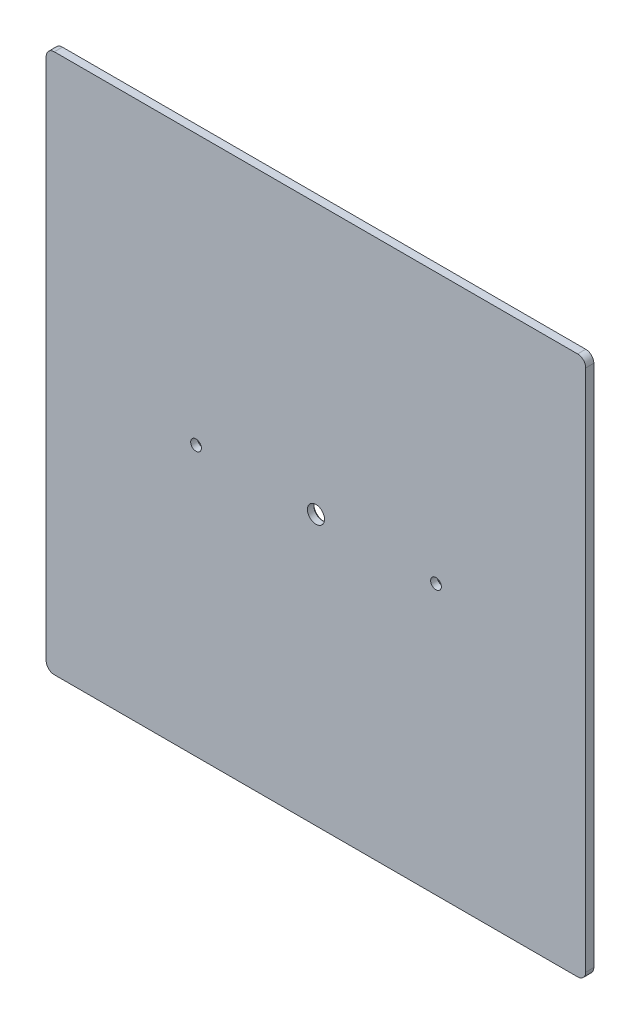
ISO-10303-21;
HEADER;
FILE_DESCRIPTION(('STEP AP214'),'2;1');
FILE_NAME('part.step','',(''),(''),'','','');
FILE_SCHEMA(('AUTOMOTIVE_DESIGN { 1 0 10303 214 1 1 1 1 }'));
ENDSEC;
DATA;
#1=APPLICATION_CONTEXT('core data for automotive mechanical design processes');
#2=APPLICATION_PROTOCOL_DEFINITION('international standard','automotive_design',2000,#1);
#3=PRODUCT_CONTEXT('',#1,'mechanical');
#4=PRODUCT('Part','Part','',(#3));
#5=PRODUCT_RELATED_PRODUCT_CATEGORY('part','',(#4));
#6=PRODUCT_DEFINITION_FORMATION('','',#4);
#7=PRODUCT_DEFINITION_CONTEXT('part definition',#1,'design');
#8=PRODUCT_DEFINITION('design','',#6,#7);
#9=PRODUCT_DEFINITION_SHAPE('','',#8);
#10=(LENGTH_UNIT() NAMED_UNIT(*) SI_UNIT(.MILLI.,.METRE.));
#11=(NAMED_UNIT(*) PLANE_ANGLE_UNIT() SI_UNIT($,.RADIAN.));
#12=(NAMED_UNIT(*) SI_UNIT($,.STERADIAN.) SOLID_ANGLE_UNIT());
#13=UNCERTAINTY_MEASURE_WITH_UNIT(LENGTH_MEASURE(1.E-05),#10,'distance_accuracy_value','');
#14=(GEOMETRIC_REPRESENTATION_CONTEXT(3) GLOBAL_UNCERTAINTY_ASSIGNED_CONTEXT((#13)) GLOBAL_UNIT_ASSIGNED_CONTEXT((#10,
#11,#12)) REPRESENTATION_CONTEXT('',''));
#15=CARTESIAN_POINT('',(0.,0.,0.));
#16=DIRECTION('',(0.,0.,1.));
#17=DIRECTION('',(1.,0.,0.));
#18=AXIS2_PLACEMENT_3D('',#15,#16,#17);
#19=CARTESIAN_POINT('',(100.,100.,3.));
#20=DIRECTION('',(-1.,0.,0.));
#21=DIRECTION('',(0.,-1.,0.));
#22=AXIS2_PLACEMENT_3D('',#19,#20,#21);
#23=PLANE('',#22);
#24=DIRECTION('',(0.,1.,0.));
#25=VECTOR('',#24,1.);
#26=CARTESIAN_POINT('',(100.,100.,3.));
#27=LINE('',#26,#25);
#28=CARTESIAN_POINT('',(100.,-97.,3.));
#29=VERTEX_POINT('',#28);
#30=CARTESIAN_POINT('',(100.,97.,3.));
#31=VERTEX_POINT('',#30);
#32=EDGE_CURVE('E143',#29,#31,#27,.T.);
#33=ORIENTED_EDGE('',*,*,#32,.F.);
#34=DIRECTION('',(0.,0.,-1.));
#35=VECTOR('',#34,1.);
#36=CARTESIAN_POINT('',(100.,-97.,3.));
#37=LINE('',#36,#35);
#38=CARTESIAN_POINT('',(100.,-97.,0.));
#39=VERTEX_POINT('',#38);
#40=EDGE_CURVE('E182',#29,#39,#37,.T.);
#41=ORIENTED_EDGE('',*,*,#40,.T.);
#42=DIRECTION('',(0.,1.,0.));
#43=VECTOR('',#42,1.);
#44=CARTESIAN_POINT('',(100.,100.,0.));
#45=LINE('',#44,#43);
#46=CARTESIAN_POINT('',(100.,97.,0.));
#47=VERTEX_POINT('',#46);
#48=EDGE_CURVE('E197',#39,#47,#45,.T.);
#49=ORIENTED_EDGE('',*,*,#48,.T.);
#50=DIRECTION('',(0.,0.,-1.));
#51=VECTOR('',#50,1.);
#52=CARTESIAN_POINT('',(100.,97.,3.));
#53=LINE('',#52,#51);
#54=EDGE_CURVE('E179',#47,#31,#53,.F.);
#55=ORIENTED_EDGE('',*,*,#54,.T.);
#56=EDGE_LOOP('',(#33,#41,#49,#55));
#57=FACE_BOUND('',#56,.T.);
#58=ADVANCED_FACE('F47',(#57),#23,.F.);
#59=CARTESIAN_POINT('',(-100.,100.,3.));
#60=DIRECTION('',(0.,-1.,0.));
#61=DIRECTION('',(0.,0.,-1.));
#62=AXIS2_PLACEMENT_3D('',#59,#60,#61);
#63=PLANE('',#62);
#64=DIRECTION('',(-1.,0.,0.));
#65=VECTOR('',#64,1.);
#66=CARTESIAN_POINT('',(-100.,100.,3.));
#67=LINE('',#66,#65);
#68=CARTESIAN_POINT('',(97.,100.,3.));
#69=VERTEX_POINT('',#68);
#70=CARTESIAN_POINT('',(-97.,100.,3.));
#71=VERTEX_POINT('',#70);
#72=EDGE_CURVE('E148',#69,#71,#67,.T.);
#73=ORIENTED_EDGE('',*,*,#72,.F.);
#74=DIRECTION('',(0.,0.,-1.));
#75=VECTOR('',#74,1.);
#76=CARTESIAN_POINT('',(97.,100.,3.));
#77=LINE('',#76,#75);
#78=CARTESIAN_POINT('',(97.,100.,0.));
#79=VERTEX_POINT('',#78);
#80=EDGE_CURVE('E11',#69,#79,#77,.T.);
#81=ORIENTED_EDGE('',*,*,#80,.T.);
#82=DIRECTION('',(-1.,0.,0.));
#83=VECTOR('',#82,1.);
#84=CARTESIAN_POINT('',(-100.,100.,0.));
#85=LINE('',#84,#83);
#86=CARTESIAN_POINT('',(-97.,100.,0.));
#87=VERTEX_POINT('',#86);
#88=EDGE_CURVE('E150',#79,#87,#85,.T.);
#89=ORIENTED_EDGE('',*,*,#88,.T.);
#90=DIRECTION('',(0.,0.,-1.));
#91=VECTOR('',#90,1.);
#92=CARTESIAN_POINT('',(-97.,100.,3.));
#93=LINE('',#92,#91);
#94=EDGE_CURVE('E56',#87,#71,#93,.F.);
#95=ORIENTED_EDGE('',*,*,#94,.T.);
#96=EDGE_LOOP('',(#73,#81,#89,#95));
#97=FACE_BOUND('',#96,.T.);
#98=ADVANCED_FACE('F203',(#97),#63,.F.);
#99=CARTESIAN_POINT('',(-100.,100.,3.));
#100=DIRECTION('',(1.,0.,0.));
#101=DIRECTION('',(0.,1.,0.));
#102=AXIS2_PLACEMENT_3D('',#99,#100,#101);
#103=PLANE('',#102);
#104=DIRECTION('',(0.,-1.,0.));
#105=VECTOR('',#104,1.);
#106=CARTESIAN_POINT('',(-100.,100.,0.));
#107=LINE('',#106,#105);
#108=CARTESIAN_POINT('',(-100.,97.,0.));
#109=VERTEX_POINT('',#108);
#110=CARTESIAN_POINT('',(-100.,-97.,0.));
#111=VERTEX_POINT('',#110);
#112=EDGE_CURVE('E144',#109,#111,#107,.T.);
#113=ORIENTED_EDGE('',*,*,#112,.T.);
#114=DIRECTION('',(0.,0.,-1.));
#115=VECTOR('',#114,1.);
#116=CARTESIAN_POINT('',(-100.,-97.,3.));
#117=LINE('',#116,#115);
#118=CARTESIAN_POINT('',(-100.,-97.,3.));
#119=VERTEX_POINT('',#118);
#120=EDGE_CURVE('E119',#111,#119,#117,.F.);
#121=ORIENTED_EDGE('',*,*,#120,.T.);
#122=DIRECTION('',(0.,-1.,0.));
#123=VECTOR('',#122,1.);
#124=CARTESIAN_POINT('',(-100.,100.,3.));
#125=LINE('',#124,#123);
#126=CARTESIAN_POINT('',(-100.,97.,3.));
#127=VERTEX_POINT('',#126);
#128=EDGE_CURVE('E188',#127,#119,#125,.T.);
#129=ORIENTED_EDGE('',*,*,#128,.F.);
#130=DIRECTION('',(0.,0.,-1.));
#131=VECTOR('',#130,1.);
#132=CARTESIAN_POINT('',(-100.,97.,3.));
#133=LINE('',#132,#131);
#134=EDGE_CURVE('E125',#127,#109,#133,.T.);
#135=ORIENTED_EDGE('',*,*,#134,.T.);
#136=EDGE_LOOP('',(#113,#121,#129,#135));
#137=FACE_BOUND('',#136,.T.);
#138=ADVANCED_FACE('F210',(#137),#103,.F.);
#139=CARTESIAN_POINT('',(-100.,-100.,3.));
#140=DIRECTION('',(0.,1.,0.));
#141=DIRECTION('',(0.,0.,1.));
#142=AXIS2_PLACEMENT_3D('',#139,#140,#141);
#143=PLANE('',#142);
#144=DIRECTION('',(1.,0.,0.));
#145=VECTOR('',#144,1.);
#146=CARTESIAN_POINT('',(-100.,-100.,3.));
#147=LINE('',#146,#145);
#148=CARTESIAN_POINT('',(-97.,-100.,3.));
#149=VERTEX_POINT('',#148);
#150=CARTESIAN_POINT('',(97.,-100.,3.));
#151=VERTEX_POINT('',#150);
#152=EDGE_CURVE('E135',#149,#151,#147,.T.);
#153=ORIENTED_EDGE('',*,*,#152,.F.);
#154=DIRECTION('',(0.,0.,-1.));
#155=VECTOR('',#154,1.);
#156=CARTESIAN_POINT('',(-97.,-100.,3.));
#157=LINE('',#156,#155);
#158=CARTESIAN_POINT('',(-97.,-100.,0.));
#159=VERTEX_POINT('',#158);
#160=EDGE_CURVE('E118',#149,#159,#157,.T.);
#161=ORIENTED_EDGE('',*,*,#160,.T.);
#162=DIRECTION('',(1.,0.,0.));
#163=VECTOR('',#162,1.);
#164=CARTESIAN_POINT('',(-100.,-100.,0.));
#165=LINE('',#164,#163);
#166=CARTESIAN_POINT('',(97.,-100.,0.));
#167=VERTEX_POINT('',#166);
#168=EDGE_CURVE('E132',#159,#167,#165,.T.);
#169=ORIENTED_EDGE('',*,*,#168,.T.);
#170=DIRECTION('',(0.,0.,-1.));
#171=VECTOR('',#170,1.);
#172=CARTESIAN_POINT('',(97.,-100.,3.));
#173=LINE('',#172,#171);
#174=EDGE_CURVE('E138',#167,#151,#173,.F.);
#175=ORIENTED_EDGE('',*,*,#174,.T.);
#176=EDGE_LOOP('',(#153,#161,#169,#175));
#177=FACE_BOUND('',#176,.T.);
#178=ADVANCED_FACE('F131',(#177),#143,.F.);
#179=CARTESIAN_POINT('',(0.,0.,3.));
#180=DIRECTION('',(0.,0.,1.));
#181=DIRECTION('',(1.,0.,0.));
#182=AXIS2_PLACEMENT_3D('',#179,#180,#181);
#183=PLANE('',#182);
#184=CARTESIAN_POINT('',(44.5,0.,3.));
#185=DIRECTION('',(0.,0.,-1.));
#186=DIRECTION('',(-1.,0.,0.));
#187=AXIS2_PLACEMENT_3D('',#184,#185,#186);
#188=CIRCLE('',#187,1.984375);
#189=CARTESIAN_POINT('',(42.515625,0.,3.));
#190=VERTEX_POINT('',#189);
#191=EDGE_CURVE('E297',#190,#190,#188,.T.);
#192=ORIENTED_EDGE('',*,*,#191,.T.);
#193=EDGE_LOOP('',(#192));
#194=FACE_BOUND('',#193,.T.);
#195=CARTESIAN_POINT('',(-44.45,0.,3.));
#196=DIRECTION('',(0.,0.,-1.));
#197=DIRECTION('',(-1.,0.,0.));
#198=AXIS2_PLACEMENT_3D('',#195,#196,#197);
#199=CIRCLE('',#198,1.984375);
#200=CARTESIAN_POINT('',(-46.434375,0.,3.));
#201=VERTEX_POINT('',#200);
#202=EDGE_CURVE('E279',#201,#201,#199,.T.);
#203=ORIENTED_EDGE('',*,*,#202,.T.);
#204=EDGE_LOOP('',(#203));
#205=FACE_BOUND('',#204,.T.);
#206=CARTESIAN_POINT('',(0.,0.,3.));
#207=DIRECTION('',(0.,0.,-1.));
#208=DIRECTION('',(-1.,0.,0.));
#209=AXIS2_PLACEMENT_3D('',#206,#207,#208);
#210=CIRCLE('',#209,3.175);
#211=CARTESIAN_POINT('',(-3.175,0.,3.));
#212=VERTEX_POINT('',#211);
#213=EDGE_CURVE('E200',#212,#212,#210,.T.);
#214=ORIENTED_EDGE('',*,*,#213,.T.);
#215=EDGE_LOOP('',(#214));
#216=FACE_BOUND('',#215,.T.);
#217=ORIENTED_EDGE('',*,*,#128,.T.);
#218=CARTESIAN_POINT('',(-97.,-97.,3.));
#219=DIRECTION('',(0.,0.,1.));
#220=DIRECTION('',(1.,0.,0.));
#221=AXIS2_PLACEMENT_3D('',#218,#219,#220);
#222=CIRCLE('',#221,3.);
#223=EDGE_CURVE('E176',#119,#149,#222,.T.);
#224=ORIENTED_EDGE('',*,*,#223,.T.);
#225=ORIENTED_EDGE('',*,*,#152,.T.);
#226=CARTESIAN_POINT('',(97.,-97.,3.));
#227=DIRECTION('',(0.,0.,1.));
#228=DIRECTION('',(1.,0.,0.));
#229=AXIS2_PLACEMENT_3D('',#226,#227,#228);
#230=CIRCLE('',#229,3.);
#231=EDGE_CURVE('E173',#151,#29,#230,.T.);
#232=ORIENTED_EDGE('',*,*,#231,.T.);
#233=ORIENTED_EDGE('',*,*,#32,.T.);
#234=CARTESIAN_POINT('',(97.,97.,3.));
#235=DIRECTION('',(0.,0.,1.));
#236=DIRECTION('',(1.,0.,0.));
#237=AXIS2_PLACEMENT_3D('',#234,#235,#236);
#238=CIRCLE('',#237,3.);
#239=EDGE_CURVE('E69',#31,#69,#238,.T.);
#240=ORIENTED_EDGE('',*,*,#239,.T.);
#241=ORIENTED_EDGE('',*,*,#72,.T.);
#242=CARTESIAN_POINT('',(-97.,97.,3.));
#243=DIRECTION('',(0.,0.,1.));
#244=DIRECTION('',(1.,0.,0.));
#245=AXIS2_PLACEMENT_3D('',#242,#243,#244);
#246=CIRCLE('',#245,3.);
#247=EDGE_CURVE('E168',#71,#127,#246,.T.);
#248=ORIENTED_EDGE('',*,*,#247,.T.);
#249=EDGE_LOOP('',(#217,#224,#225,#232,#233,#240,#241,#248));
#250=FACE_BOUND('',#249,.T.);
#251=ADVANCED_FACE('F208',(#194,#205,#216,#250),#183,.T.);
#252=CARTESIAN_POINT('',(0.,0.,0.));
#253=DIRECTION('',(0.,0.,1.));
#254=DIRECTION('',(1.,0.,0.));
#255=AXIS2_PLACEMENT_3D('',#252,#253,#254);
#256=PLANE('',#255);
#257=CARTESIAN_POINT('',(44.5,0.,0.));
#258=DIRECTION('',(0.,0.,-1.));
#259=DIRECTION('',(-1.,0.,0.));
#260=AXIS2_PLACEMENT_3D('',#257,#258,#259);
#261=CIRCLE('',#260,2.619375);
#262=CARTESIAN_POINT('',(41.880625,0.,0.));
#263=VERTEX_POINT('',#262);
#264=EDGE_CURVE('E268',#263,#263,#261,.T.);
#265=ORIENTED_EDGE('',*,*,#264,.F.);
#266=EDGE_LOOP('',(#265));
#267=FACE_BOUND('',#266,.T.);
#268=CARTESIAN_POINT('',(-44.45,0.,0.));
#269=DIRECTION('',(0.,0.,-1.));
#270=DIRECTION('',(-1.,0.,0.));
#271=AXIS2_PLACEMENT_3D('',#268,#269,#270);
#272=CIRCLE('',#271,2.619375);
#273=CARTESIAN_POINT('',(-47.069375,0.,0.));
#274=VERTEX_POINT('',#273);
#275=EDGE_CURVE('E272',#274,#274,#272,.T.);
#276=ORIENTED_EDGE('',*,*,#275,.F.);
#277=EDGE_LOOP('',(#276));
#278=FACE_BOUND('',#277,.T.);
#279=CARTESIAN_POINT('',(0.,0.,0.));
#280=DIRECTION('',(0.,0.,-1.));
#281=DIRECTION('',(-1.,0.,0.));
#282=AXIS2_PLACEMENT_3D('',#279,#280,#281);
#283=CIRCLE('',#282,3.81);
#284=CARTESIAN_POINT('',(-3.81,0.,0.));
#285=VERTEX_POINT('',#284);
#286=EDGE_CURVE('E275',#285,#285,#283,.T.);
#287=ORIENTED_EDGE('',*,*,#286,.F.);
#288=EDGE_LOOP('',(#287));
#289=FACE_BOUND('',#288,.T.);
#290=ORIENTED_EDGE('',*,*,#168,.F.);
#291=CARTESIAN_POINT('',(-97.,-97.,0.));
#292=DIRECTION('',(0.,0.,1.));
#293=DIRECTION('',(1.,0.,0.));
#294=AXIS2_PLACEMENT_3D('',#291,#292,#293);
#295=CIRCLE('',#294,3.);
#296=EDGE_CURVE('E114',#159,#111,#295,.F.);
#297=ORIENTED_EDGE('',*,*,#296,.T.);
#298=ORIENTED_EDGE('',*,*,#112,.F.);
#299=CARTESIAN_POINT('',(-97.,97.,0.));
#300=DIRECTION('',(0.,0.,1.));
#301=DIRECTION('',(1.,0.,0.));
#302=AXIS2_PLACEMENT_3D('',#299,#300,#301);
#303=CIRCLE('',#302,3.);
#304=EDGE_CURVE('E137',#109,#87,#303,.F.);
#305=ORIENTED_EDGE('',*,*,#304,.T.);
#306=ORIENTED_EDGE('',*,*,#88,.F.);
#307=CARTESIAN_POINT('',(97.,97.,0.));
#308=DIRECTION('',(0.,0.,1.));
#309=DIRECTION('',(1.,0.,0.));
#310=AXIS2_PLACEMENT_3D('',#307,#308,#309);
#311=CIRCLE('',#310,3.);
#312=EDGE_CURVE('E158',#79,#47,#311,.F.);
#313=ORIENTED_EDGE('',*,*,#312,.T.);
#314=ORIENTED_EDGE('',*,*,#48,.F.);
#315=CARTESIAN_POINT('',(97.,-97.,0.));
#316=DIRECTION('',(0.,0.,1.));
#317=DIRECTION('',(1.,0.,0.));
#318=AXIS2_PLACEMENT_3D('',#315,#316,#317);
#319=CIRCLE('',#318,3.);
#320=EDGE_CURVE('E126',#39,#167,#319,.F.);
#321=ORIENTED_EDGE('',*,*,#320,.T.);
#322=EDGE_LOOP('',(#290,#297,#298,#305,#306,#313,#314,#321));
#323=FACE_BOUND('',#322,.T.);
#324=ADVANCED_FACE('F140',(#267,#278,#289,#323),#256,.F.);
#325=CARTESIAN_POINT('',(-97.,-97.,3.));
#326=DIRECTION('',(0.,0.,-1.));
#327=DIRECTION('',(-1.,0.,0.));
#328=AXIS2_PLACEMENT_3D('',#325,#326,#327);
#329=CYLINDRICAL_SURFACE('',#328,3.);
#330=ORIENTED_EDGE('',*,*,#223,.F.);
#331=ORIENTED_EDGE('',*,*,#120,.F.);
#332=ORIENTED_EDGE('',*,*,#296,.F.);
#333=ORIENTED_EDGE('',*,*,#160,.F.);
#334=EDGE_LOOP('',(#330,#331,#332,#333));
#335=FACE_BOUND('',#334,.T.);
#336=ADVANCED_FACE('F117',(#335),#329,.T.);
#337=CARTESIAN_POINT('',(97.,-97.,3.));
#338=DIRECTION('',(0.,0.,-1.));
#339=DIRECTION('',(-1.,0.,0.));
#340=AXIS2_PLACEMENT_3D('',#337,#338,#339);
#341=CYLINDRICAL_SURFACE('',#340,3.);
#342=ORIENTED_EDGE('',*,*,#231,.F.);
#343=ORIENTED_EDGE('',*,*,#174,.F.);
#344=ORIENTED_EDGE('',*,*,#320,.F.);
#345=ORIENTED_EDGE('',*,*,#40,.F.);
#346=EDGE_LOOP('',(#342,#343,#344,#345));
#347=FACE_BOUND('',#346,.T.);
#348=ADVANCED_FACE('F228',(#347),#341,.T.);
#349=CARTESIAN_POINT('',(97.,97.,3.));
#350=DIRECTION('',(0.,0.,-1.));
#351=DIRECTION('',(-1.,0.,0.));
#352=AXIS2_PLACEMENT_3D('',#349,#350,#351);
#353=CYLINDRICAL_SURFACE('',#352,3.);
#354=ORIENTED_EDGE('',*,*,#239,.F.);
#355=ORIENTED_EDGE('',*,*,#54,.F.);
#356=ORIENTED_EDGE('',*,*,#312,.F.);
#357=ORIENTED_EDGE('',*,*,#80,.F.);
#358=EDGE_LOOP('',(#354,#355,#356,#357));
#359=FACE_BOUND('',#358,.T.);
#360=ADVANCED_FACE('F230',(#359),#353,.T.);
#361=CARTESIAN_POINT('',(-97.,97.,3.));
#362=DIRECTION('',(0.,0.,-1.));
#363=DIRECTION('',(-1.,0.,0.));
#364=AXIS2_PLACEMENT_3D('',#361,#362,#363);
#365=CYLINDRICAL_SURFACE('',#364,3.);
#366=ORIENTED_EDGE('',*,*,#247,.F.);
#367=ORIENTED_EDGE('',*,*,#94,.F.);
#368=ORIENTED_EDGE('',*,*,#304,.F.);
#369=ORIENTED_EDGE('',*,*,#134,.F.);
#370=EDGE_LOOP('',(#366,#367,#368,#369));
#371=FACE_BOUND('',#370,.T.);
#372=ADVANCED_FACE('F49',(#371),#365,.T.);
#373=CARTESIAN_POINT('',(0.,0.,0.));
#374=DIRECTION('',(0.,0.,-1.));
#375=DIRECTION('',(-1.,0.,0.));
#376=AXIS2_PLACEMENT_3D('',#373,#374,#375);
#377=CYLINDRICAL_SURFACE('',#376,3.175);
#378=ORIENTED_EDGE('',*,*,#213,.F.);
#379=EDGE_LOOP('',(#378));
#380=FACE_BOUND('',#379,.T.);
#381=CARTESIAN_POINT('',(0.,0.,0.634999999999999));
#382=DIRECTION('',(0.,0.,-1.));
#383=DIRECTION('',(-1.,0.,0.));
#384=AXIS2_PLACEMENT_3D('',#381,#382,#383);
#385=CIRCLE('',#384,3.175);
#386=CARTESIAN_POINT('',(-3.175,0.,0.634999999999999));
#387=VERTEX_POINT('',#386);
#388=EDGE_CURVE('E278',#387,#387,#385,.T.);
#389=ORIENTED_EDGE('',*,*,#388,.T.);
#390=EDGE_LOOP('',(#389));
#391=FACE_BOUND('',#390,.T.);
#392=ADVANCED_FACE('F237',(#380,#391),#377,.F.);
#393=CARTESIAN_POINT('',(0.,0.,0.));
#394=DIRECTION('',(0.,0.,-1.));
#395=DIRECTION('',(-1.,0.,0.));
#396=AXIS2_PLACEMENT_3D('',#393,#394,#395);
#397=CONICAL_SURFACE('',#396,3.81,0.785398163397449);
#398=ORIENTED_EDGE('',*,*,#388,.F.);
#399=EDGE_LOOP('',(#398));
#400=FACE_BOUND('',#399,.T.);
#401=ORIENTED_EDGE('',*,*,#286,.T.);
#402=EDGE_LOOP('',(#401));
#403=FACE_BOUND('',#402,.T.);
#404=ADVANCED_FACE('F244',(#400,#403),#397,.F.);
#405=CARTESIAN_POINT('',(-44.45,0.,0.));
#406=DIRECTION('',(0.,0.,-1.));
#407=DIRECTION('',(-1.,0.,0.));
#408=AXIS2_PLACEMENT_3D('',#405,#406,#407);
#409=CYLINDRICAL_SURFACE('',#408,1.984375);
#410=ORIENTED_EDGE('',*,*,#202,.F.);
#411=EDGE_LOOP('',(#410));
#412=FACE_BOUND('',#411,.T.);
#413=CARTESIAN_POINT('',(-44.45,0.,0.532828265797573));
#414=DIRECTION('',(0.,0.,-1.));
#415=DIRECTION('',(-1.,0.,0.));
#416=AXIS2_PLACEMENT_3D('',#413,#414,#415);
#417=CIRCLE('',#416,1.984375);
#418=CARTESIAN_POINT('',(-46.434375,0.,0.532828265797573));
#419=VERTEX_POINT('',#418);
#420=EDGE_CURVE('E286',#419,#419,#417,.T.);
#421=ORIENTED_EDGE('',*,*,#420,.T.);
#422=EDGE_LOOP('',(#421));
#423=FACE_BOUND('',#422,.T.);
#424=ADVANCED_FACE('F250',(#412,#423),#409,.F.);
#425=CARTESIAN_POINT('',(-44.45,0.,0.));
#426=DIRECTION('',(0.,0.,-1.));
#427=DIRECTION('',(-1.,0.,0.));
#428=AXIS2_PLACEMENT_3D('',#425,#426,#427);
#429=CONICAL_SURFACE('',#428,2.619375,0.872664625997166);
#430=ORIENTED_EDGE('',*,*,#420,.F.);
#431=EDGE_LOOP('',(#430));
#432=FACE_BOUND('',#431,.T.);
#433=ORIENTED_EDGE('',*,*,#275,.T.);
#434=EDGE_LOOP('',(#433));
#435=FACE_BOUND('',#434,.T.);
#436=ADVANCED_FACE('F315',(#432,#435),#429,.F.);
#437=CARTESIAN_POINT('',(44.5,0.,0.));
#438=DIRECTION('',(0.,0.,-1.));
#439=DIRECTION('',(-1.,0.,0.));
#440=AXIS2_PLACEMENT_3D('',#437,#438,#439);
#441=CYLINDRICAL_SURFACE('',#440,1.984375);
#442=ORIENTED_EDGE('',*,*,#191,.F.);
#443=EDGE_LOOP('',(#442));
#444=FACE_BOUND('',#443,.T.);
#445=CARTESIAN_POINT('',(44.5,0.,0.532828265797573));
#446=DIRECTION('',(0.,0.,-1.));
#447=DIRECTION('',(-1.,0.,0.));
#448=AXIS2_PLACEMENT_3D('',#445,#446,#447);
#449=CIRCLE('',#448,1.984375);
#450=CARTESIAN_POINT('',(42.515625,0.,0.532828265797573));
#451=VERTEX_POINT('',#450);
#452=EDGE_CURVE('E301',#451,#451,#449,.T.);
#453=ORIENTED_EDGE('',*,*,#452,.T.);
#454=EDGE_LOOP('',(#453));
#455=FACE_BOUND('',#454,.T.);
#456=ADVANCED_FACE('F309',(#444,#455),#441,.F.);
#457=CARTESIAN_POINT('',(44.5,0.,0.));
#458=DIRECTION('',(0.,0.,-1.));
#459=DIRECTION('',(-1.,0.,0.));
#460=AXIS2_PLACEMENT_3D('',#457,#458,#459);
#461=CONICAL_SURFACE('',#460,2.619375,0.872664625997166);
#462=ORIENTED_EDGE('',*,*,#452,.F.);
#463=EDGE_LOOP('',(#462));
#464=FACE_BOUND('',#463,.T.);
#465=ORIENTED_EDGE('',*,*,#264,.T.);
#466=EDGE_LOOP('',(#465));
#467=FACE_BOUND('',#466,.T.);
#468=ADVANCED_FACE('F307',(#464,#467),#461,.F.);
#469=CLOSED_SHELL('',(#58,#98,#138,#178,#251,#324,#336,#348,#360,#372,#392,#404,#424,#436,#456,#468));
#470=MANIFOLD_SOLID_BREP('B2',#469);
#471=ADVANCED_BREP_SHAPE_REPRESENTATION('',(#18,#470),#14);
#472=SHAPE_DEFINITION_REPRESENTATION(#9,#471);
ENDSEC;
END-ISO-10303-21;
